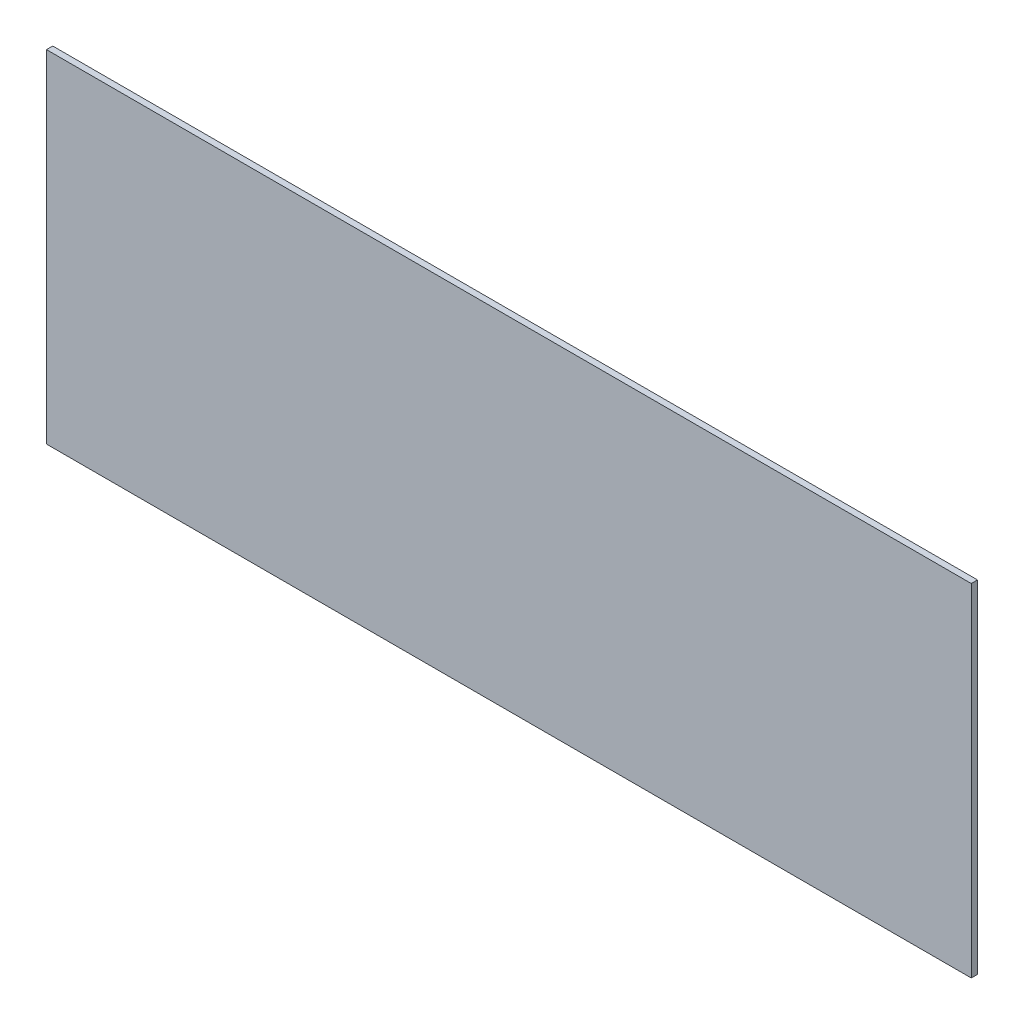
ISO-10303-21;
HEADER;
FILE_DESCRIPTION(('STEP AP214'),'2;1');
FILE_NAME('part.step','',(''),(''),'','','');
FILE_SCHEMA(('AUTOMOTIVE_DESIGN { 1 0 10303 214 1 1 1 1 }'));
ENDSEC;
DATA;
#1=APPLICATION_CONTEXT('core data for automotive mechanical design processes');
#2=APPLICATION_PROTOCOL_DEFINITION('international standard','automotive_design',2000,#1);
#3=PRODUCT_CONTEXT('',#1,'mechanical');
#4=PRODUCT('Part','Part','',(#3));
#5=PRODUCT_RELATED_PRODUCT_CATEGORY('part','',(#4));
#6=PRODUCT_DEFINITION_FORMATION('','',#4);
#7=PRODUCT_DEFINITION_CONTEXT('part definition',#1,'design');
#8=PRODUCT_DEFINITION('design','',#6,#7);
#9=PRODUCT_DEFINITION_SHAPE('','',#8);
#10=(LENGTH_UNIT() NAMED_UNIT(*) SI_UNIT(.MILLI.,.METRE.));
#11=(NAMED_UNIT(*) PLANE_ANGLE_UNIT() SI_UNIT($,.RADIAN.));
#12=(NAMED_UNIT(*) SI_UNIT($,.STERADIAN.) SOLID_ANGLE_UNIT());
#13=UNCERTAINTY_MEASURE_WITH_UNIT(LENGTH_MEASURE(1.E-05),#10,'distance_accuracy_value','');
#14=(GEOMETRIC_REPRESENTATION_CONTEXT(3) GLOBAL_UNCERTAINTY_ASSIGNED_CONTEXT((#13)) GLOBAL_UNIT_ASSIGNED_CONTEXT((#10,
#11,#12)) REPRESENTATION_CONTEXT('',''));
#15=CARTESIAN_POINT('',(0.,0.,0.));
#16=DIRECTION('',(0.,0.,1.));
#17=DIRECTION('',(1.,0.,0.));
#18=AXIS2_PLACEMENT_3D('',#15,#16,#17);
#19=CARTESIAN_POINT('',(5.00000000000001,5.,0.5));
#20=DIRECTION('',(1.,0.,0.));
#21=DIRECTION('',(0.,0.,1.));
#22=AXIS2_PLACEMENT_3D('',#19,#20,#21);
#23=PLANE('',#22);
#24=DIRECTION('',(0.,-1.,0.));
#25=VECTOR('',#24,1.);
#26=CARTESIAN_POINT('',(5.00000000000001,5.,1.5));
#27=LINE('',#26,#25);
#28=CARTESIAN_POINT('',(5.00000000000001,59.6,1.5));
#29=VERTEX_POINT('',#28);
#30=CARTESIAN_POINT('',(5.00000000000001,5.,1.5));
#31=VERTEX_POINT('',#30);
#32=EDGE_CURVE('E95',#29,#31,#27,.T.);
#33=ORIENTED_EDGE('',*,*,#32,.F.);
#34=DIRECTION('',(0.,0.,1.));
#35=VECTOR('',#34,1.);
#36=CARTESIAN_POINT('',(5.00000000000001,59.6,0.5));
#37=LINE('',#36,#35);
#38=CARTESIAN_POINT('',(5.00000000000001,59.6,0.5));
#39=VERTEX_POINT('',#38);
#40=EDGE_CURVE('E94',#39,#29,#37,.T.);
#41=ORIENTED_EDGE('',*,*,#40,.F.);
#42=DIRECTION('',(0.,-1.,0.));
#43=VECTOR('',#42,1.);
#44=CARTESIAN_POINT('',(5.00000000000001,5.,0.5));
#45=LINE('',#44,#43);
#46=CARTESIAN_POINT('',(5.00000000000001,5.,0.5));
#47=VERTEX_POINT('',#46);
#48=EDGE_CURVE('E89',#39,#47,#45,.T.);
#49=ORIENTED_EDGE('',*,*,#48,.T.);
#50=DIRECTION('',(0.,0.,1.));
#51=VECTOR('',#50,1.);
#52=CARTESIAN_POINT('',(5.00000000000001,5.,0.5));
#53=LINE('',#52,#51);
#54=EDGE_CURVE('E11',#47,#31,#53,.T.);
#55=ORIENTED_EDGE('',*,*,#54,.T.);
#56=EDGE_LOOP('',(#33,#41,#49,#55));
#57=FACE_BOUND('',#56,.T.);
#58=ADVANCED_FACE('F32',(#57),#23,.F.);
#59=CARTESIAN_POINT('',(5.00000000000001,5.,0.5));
#60=DIRECTION('',(0.,1.,0.));
#61=DIRECTION('',(0.,0.,-1.));
#62=AXIS2_PLACEMENT_3D('',#59,#60,#61);
#63=PLANE('',#62);
#64=DIRECTION('',(1.,0.,0.));
#65=VECTOR('',#64,1.);
#66=CARTESIAN_POINT('',(5.00000000000001,5.,1.5));
#67=LINE('',#66,#65);
#68=CARTESIAN_POINT('',(152.8,5.,1.5));
#69=VERTEX_POINT('',#68);
#70=EDGE_CURVE('E97',#31,#69,#67,.T.);
#71=ORIENTED_EDGE('',*,*,#70,.F.);
#72=ORIENTED_EDGE('',*,*,#54,.F.);
#73=DIRECTION('',(1.,0.,0.));
#74=VECTOR('',#73,1.);
#75=CARTESIAN_POINT('',(5.00000000000001,5.,0.5));
#76=LINE('',#75,#74);
#77=CARTESIAN_POINT('',(152.8,5.,0.5));
#78=VERTEX_POINT('',#77);
#79=EDGE_CURVE('E73',#47,#78,#76,.T.);
#80=ORIENTED_EDGE('',*,*,#79,.T.);
#81=DIRECTION('',(0.,0.,1.));
#82=VECTOR('',#81,1.);
#83=CARTESIAN_POINT('',(152.8,5.,0.5));
#84=LINE('',#83,#82);
#85=EDGE_CURVE('E40',#78,#69,#84,.T.);
#86=ORIENTED_EDGE('',*,*,#85,.T.);
#87=EDGE_LOOP('',(#71,#72,#80,#86));
#88=FACE_BOUND('',#87,.T.);
#89=ADVANCED_FACE('F87',(#88),#63,.F.);
#90=CARTESIAN_POINT('',(152.8,5.,0.5));
#91=DIRECTION('',(-1.,0.,0.));
#92=DIRECTION('',(0.,0.,-1.));
#93=AXIS2_PLACEMENT_3D('',#90,#91,#92);
#94=PLANE('',#93);
#95=DIRECTION('',(0.,1.,0.));
#96=VECTOR('',#95,1.);
#97=CARTESIAN_POINT('',(152.8,5.,1.5));
#98=LINE('',#97,#96);
#99=CARTESIAN_POINT('',(152.8,59.6,1.5));
#100=VERTEX_POINT('',#99);
#101=EDGE_CURVE('E83',#69,#100,#98,.T.);
#102=ORIENTED_EDGE('',*,*,#101,.F.);
#103=ORIENTED_EDGE('',*,*,#85,.F.);
#104=DIRECTION('',(0.,1.,0.));
#105=VECTOR('',#104,1.);
#106=CARTESIAN_POINT('',(152.8,5.,0.5));
#107=LINE('',#106,#105);
#108=CARTESIAN_POINT('',(152.8,59.6,0.5));
#109=VERTEX_POINT('',#108);
#110=EDGE_CURVE('E76',#78,#109,#107,.T.);
#111=ORIENTED_EDGE('',*,*,#110,.T.);
#112=DIRECTION('',(0.,0.,1.));
#113=VECTOR('',#112,1.);
#114=CARTESIAN_POINT('',(152.8,59.6,0.5));
#115=LINE('',#114,#113);
#116=EDGE_CURVE('E86',#109,#100,#115,.T.);
#117=ORIENTED_EDGE('',*,*,#116,.T.);
#118=EDGE_LOOP('',(#102,#103,#111,#117));
#119=FACE_BOUND('',#118,.T.);
#120=ADVANCED_FACE('F82',(#119),#94,.F.);
#121=CARTESIAN_POINT('',(5.00000000000001,59.6,0.5));
#122=DIRECTION('',(0.,-1.,0.));
#123=DIRECTION('',(0.,0.,1.));
#124=AXIS2_PLACEMENT_3D('',#121,#122,#123);
#125=PLANE('',#124);
#126=DIRECTION('',(-1.,0.,0.));
#127=VECTOR('',#126,1.);
#128=CARTESIAN_POINT('',(5.00000000000001,59.6,1.5));
#129=LINE('',#128,#127);
#130=EDGE_CURVE('E62',#100,#29,#129,.T.);
#131=ORIENTED_EDGE('',*,*,#130,.F.);
#132=ORIENTED_EDGE('',*,*,#116,.F.);
#133=DIRECTION('',(-1.,0.,0.));
#134=VECTOR('',#133,1.);
#135=CARTESIAN_POINT('',(5.00000000000001,59.6,0.5));
#136=LINE('',#135,#134);
#137=EDGE_CURVE('E48',#109,#39,#136,.T.);
#138=ORIENTED_EDGE('',*,*,#137,.T.);
#139=ORIENTED_EDGE('',*,*,#40,.T.);
#140=EDGE_LOOP('',(#131,#132,#138,#139));
#141=FACE_BOUND('',#140,.T.);
#142=ADVANCED_FACE('F106',(#141),#125,.F.);
#143=CARTESIAN_POINT('',(0.,0.,0.5));
#144=DIRECTION('',(0.,0.,1.));
#145=DIRECTION('',(-1.,0.,0.));
#146=AXIS2_PLACEMENT_3D('',#143,#144,#145);
#147=PLANE('',#146);
#148=ORIENTED_EDGE('',*,*,#48,.F.);
#149=ORIENTED_EDGE('',*,*,#137,.F.);
#150=ORIENTED_EDGE('',*,*,#110,.F.);
#151=ORIENTED_EDGE('',*,*,#79,.F.);
#152=EDGE_LOOP('',(#148,#149,#150,#151));
#153=FACE_BOUND('',#152,.T.);
#154=ADVANCED_FACE('F78',(#153),#147,.F.);
#155=CARTESIAN_POINT('',(0.,0.,1.5));
#156=DIRECTION('',(0.,0.,1.));
#157=DIRECTION('',(-1.,0.,0.));
#158=AXIS2_PLACEMENT_3D('',#155,#156,#157);
#159=PLANE('',#158);
#160=ORIENTED_EDGE('',*,*,#32,.T.);
#161=ORIENTED_EDGE('',*,*,#70,.T.);
#162=ORIENTED_EDGE('',*,*,#101,.T.);
#163=ORIENTED_EDGE('',*,*,#130,.T.);
#164=EDGE_LOOP('',(#160,#161,#162,#163));
#165=FACE_BOUND('',#164,.T.);
#166=ADVANCED_FACE('F102',(#165),#159,.T.);
#167=CLOSED_SHELL('',(#58,#89,#120,#142,#154,#166));
#168=MANIFOLD_SOLID_BREP('B2',#167);
#169=ADVANCED_BREP_SHAPE_REPRESENTATION('',(#18,#168),#14);
#170=SHAPE_DEFINITION_REPRESENTATION(#9,#169);
ENDSEC;
END-ISO-10303-21;
